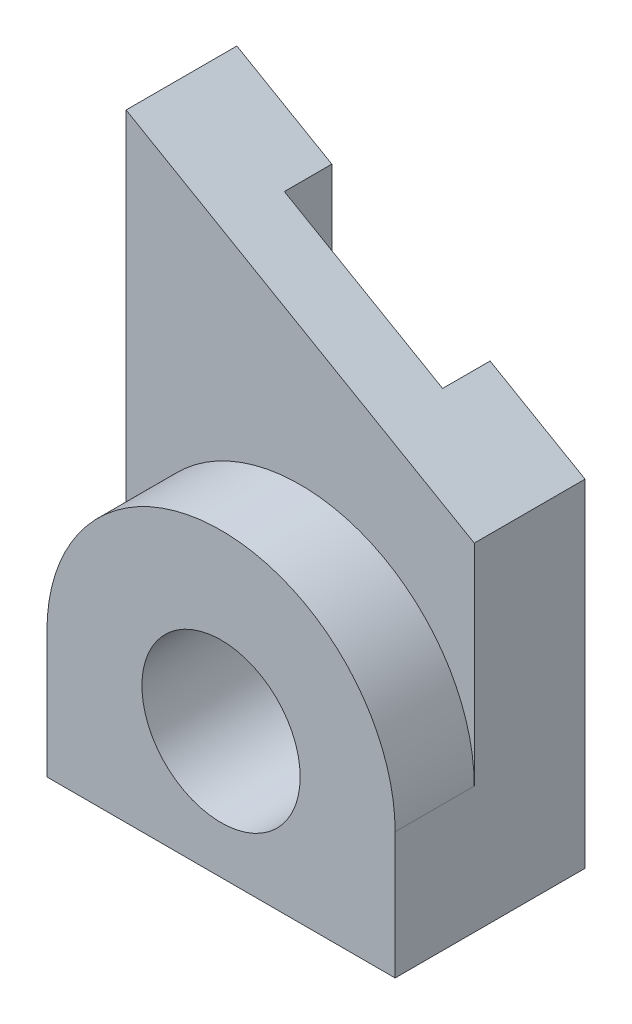
ISO-10303-21;
HEADER;
FILE_DESCRIPTION(('STEP AP214'),'2;1');
FILE_NAME('part.step','',(''),(''),'','','');
FILE_SCHEMA(('AUTOMOTIVE_DESIGN { 1 0 10303 214 1 1 1 1 }'));
ENDSEC;
DATA;
#1=APPLICATION_CONTEXT('core data for automotive mechanical design processes');
#2=APPLICATION_PROTOCOL_DEFINITION('international standard','automotive_design',2000,#1);
#3=PRODUCT_CONTEXT('',#1,'mechanical');
#4=PRODUCT('Part','Part','',(#3));
#5=PRODUCT_RELATED_PRODUCT_CATEGORY('part','',(#4));
#6=PRODUCT_DEFINITION_FORMATION('','',#4);
#7=PRODUCT_DEFINITION_CONTEXT('part definition',#1,'design');
#8=PRODUCT_DEFINITION('design','',#6,#7);
#9=PRODUCT_DEFINITION_SHAPE('','',#8);
#10=(LENGTH_UNIT() NAMED_UNIT(*) SI_UNIT(.MILLI.,.METRE.));
#11=(NAMED_UNIT(*) PLANE_ANGLE_UNIT() SI_UNIT($,.RADIAN.));
#12=(NAMED_UNIT(*) SI_UNIT($,.STERADIAN.) SOLID_ANGLE_UNIT());
#13=UNCERTAINTY_MEASURE_WITH_UNIT(LENGTH_MEASURE(1.E-05),#10,'distance_accuracy_value','');
#14=(GEOMETRIC_REPRESENTATION_CONTEXT(3) GLOBAL_UNCERTAINTY_ASSIGNED_CONTEXT((#13)) GLOBAL_UNIT_ASSIGNED_CONTEXT((#10,
#11,#12)) REPRESENTATION_CONTEXT('',''));
#15=CARTESIAN_POINT('',(0.,0.,0.));
#16=DIRECTION('',(0.,0.,1.));
#17=DIRECTION('',(1.,0.,0.));
#18=AXIS2_PLACEMENT_3D('',#15,#16,#17);
#19=CARTESIAN_POINT('',(0.,0.,-14.));
#20=DIRECTION('',(0.,0.,1.));
#21=DIRECTION('',(1.,0.,0.));
#22=AXIS2_PLACEMENT_3D('',#19,#20,#21);
#23=PLANE('',#22);
#24=DIRECTION('',(-0.866025403784436,0.500000000000004,0.));
#25=VECTOR('',#24,1.);
#26=CARTESIAN_POINT('',(17.0166604983954,29.4737205583709,-14.));
#27=LINE('',#26,#25);
#28=CARTESIAN_POINT('',(-10.,45.0717967697244,-14.));
#29=VERTEX_POINT('',#28);
#30=CARTESIAN_POINT('',(-22.,52.,-14.));
#31=VERTEX_POINT('',#30);
#32=EDGE_CURVE('E155',#29,#31,#27,.T.);
#33=ORIENTED_EDGE('',*,*,#32,.F.);
#34=DIRECTION('',(0.,-1.,0.));
#35=VECTOR('',#34,1.);
#36=CARTESIAN_POINT('',(-10.,0.,-14.));
#37=LINE('',#36,#35);
#38=CARTESIAN_POINT('',(-10.,-16.,-14.));
#39=VERTEX_POINT('',#38);
#40=EDGE_CURVE('E47',#29,#39,#37,.T.);
#41=ORIENTED_EDGE('',*,*,#40,.T.);
#42=DIRECTION('',(1.,0.,0.));
#43=VECTOR('',#42,1.);
#44=CARTESIAN_POINT('',(0.,-16.,-14.));
#45=LINE('',#44,#43);
#46=CARTESIAN_POINT('',(-22.,-16.,-14.));
#47=VERTEX_POINT('',#46);
#48=EDGE_CURVE('E146',#47,#39,#45,.T.);
#49=ORIENTED_EDGE('',*,*,#48,.F.);
#50=DIRECTION('',(0.,-1.,0.));
#51=VECTOR('',#50,1.);
#52=CARTESIAN_POINT('',(-22.,0.,-14.));
#53=LINE('',#52,#51);
#54=EDGE_CURVE('E147',#31,#47,#53,.T.);
#55=ORIENTED_EDGE('',*,*,#54,.F.);
#56=EDGE_LOOP('',(#33,#41,#49,#55));
#57=FACE_BOUND('',#56,.T.);
#58=ADVANCED_FACE('F39',(#57),#23,.F.);
#59=CARTESIAN_POINT('',(0.,0.,10.));
#60=DIRECTION('',(0.,0.,-1.));
#61=DIRECTION('',(-1.,0.,0.));
#62=AXIS2_PLACEMENT_3D('',#59,#60,#61);
#63=CYLINDRICAL_SURFACE('',#62,22.);
#64=CARTESIAN_POINT('',(0.,0.,0.));
#65=DIRECTION('',(0.,0.,1.));
#66=DIRECTION('',(1.,0.,0.));
#67=AXIS2_PLACEMENT_3D('',#64,#65,#66);
#68=CIRCLE('',#67,22.);
#69=CARTESIAN_POINT('',(-22.,0.,0.));
#70=VERTEX_POINT('',#69);
#71=CARTESIAN_POINT('',(22.,0.,0.));
#72=VERTEX_POINT('',#71);
#73=EDGE_CURVE('E169',#70,#72,#68,.F.);
#74=ORIENTED_EDGE('',*,*,#73,.F.);
#75=DIRECTION('',(0.,0.,-1.));
#76=VECTOR('',#75,1.);
#77=CARTESIAN_POINT('',(-22.,0.,10.));
#78=LINE('',#77,#76);
#79=CARTESIAN_POINT('',(-22.,0.,10.));
#80=VERTEX_POINT('',#79);
#81=EDGE_CURVE('E130',#80,#70,#78,.T.);
#82=ORIENTED_EDGE('',*,*,#81,.F.);
#83=CARTESIAN_POINT('',(0.,0.,10.));
#84=DIRECTION('',(0.,0.,1.));
#85=DIRECTION('',(1.,0.,0.));
#86=AXIS2_PLACEMENT_3D('',#83,#84,#85);
#87=CIRCLE('',#86,22.);
#88=CARTESIAN_POINT('',(22.,0.,10.));
#89=VERTEX_POINT('',#88);
#90=EDGE_CURVE('E175',#80,#89,#87,.F.);
#91=ORIENTED_EDGE('',*,*,#90,.T.);
#92=DIRECTION('',(0.,0.,-1.));
#93=VECTOR('',#92,1.);
#94=CARTESIAN_POINT('',(22.,0.,10.));
#95=LINE('',#94,#93);
#96=EDGE_CURVE('E186',#89,#72,#95,.T.);
#97=ORIENTED_EDGE('',*,*,#96,.T.);
#98=EDGE_LOOP('',(#74,#82,#91,#97));
#99=FACE_BOUND('',#98,.T.);
#100=ADVANCED_FACE('F244',(#99),#63,.T.);
#101=CARTESIAN_POINT('',(-22.,0.,10.));
#102=DIRECTION('',(1.,0.,0.));
#103=DIRECTION('',(0.,1.,0.));
#104=AXIS2_PLACEMENT_3D('',#101,#102,#103);
#105=PLANE('',#104);
#106=ORIENTED_EDGE('',*,*,#81,.T.);
#107=DIRECTION('',(0.,-1.,0.));
#108=VECTOR('',#107,1.);
#109=CARTESIAN_POINT('',(-22.,0.,0.));
#110=LINE('',#109,#108);
#111=CARTESIAN_POINT('',(-22.,52.,0.));
#112=VERTEX_POINT('',#111);
#113=EDGE_CURVE('E159',#112,#70,#110,.T.);
#114=ORIENTED_EDGE('',*,*,#113,.F.);
#115=DIRECTION('',(0.,0.,1.));
#116=VECTOR('',#115,1.);
#117=CARTESIAN_POINT('',(-22.,52.,-14.));
#118=LINE('',#117,#116);
#119=EDGE_CURVE('E167',#31,#112,#118,.T.);
#120=ORIENTED_EDGE('',*,*,#119,.F.);
#121=ORIENTED_EDGE('',*,*,#54,.T.);
#122=DIRECTION('',(0.,0.,-1.));
#123=VECTOR('',#122,1.);
#124=CARTESIAN_POINT('',(-22.,-16.,10.));
#125=LINE('',#124,#123);
#126=CARTESIAN_POINT('',(-22.,-16.,10.));
#127=VERTEX_POINT('',#126);
#128=EDGE_CURVE('E192',#127,#47,#125,.T.);
#129=ORIENTED_EDGE('',*,*,#128,.F.);
#130=DIRECTION('',(0.,-1.,0.));
#131=VECTOR('',#130,1.);
#132=CARTESIAN_POINT('',(-22.,0.,10.));
#133=LINE('',#132,#131);
#134=EDGE_CURVE('E178',#80,#127,#133,.T.);
#135=ORIENTED_EDGE('',*,*,#134,.F.);
#136=EDGE_LOOP('',(#106,#114,#120,#121,#129,#135));
#137=FACE_BOUND('',#136,.T.);
#138=ADVANCED_FACE('F204',(#137),#105,.F.);
#139=CARTESIAN_POINT('',(0.,-16.,10.));
#140=DIRECTION('',(0.,1.,0.));
#141=DIRECTION('',(0.,0.,1.));
#142=AXIS2_PLACEMENT_3D('',#139,#140,#141);
#143=PLANE('',#142);
#144=ORIENTED_EDGE('',*,*,#48,.T.);
#145=DIRECTION('',(0.,0.,-1.));
#146=VECTOR('',#145,1.);
#147=CARTESIAN_POINT('',(-10.,-16.,-14.));
#148=LINE('',#147,#146);
#149=CARTESIAN_POINT('',(-10.,-16.,-8.));
#150=VERTEX_POINT('',#149);
#151=EDGE_CURVE('E200',#150,#39,#148,.T.);
#152=ORIENTED_EDGE('',*,*,#151,.F.);
#153=DIRECTION('',(-1.,0.,0.));
#154=VECTOR('',#153,1.);
#155=CARTESIAN_POINT('',(-10.,-16.,-8.));
#156=LINE('',#155,#154);
#157=CARTESIAN_POINT('',(10.,-16.,-8.));
#158=VERTEX_POINT('',#157);
#159=EDGE_CURVE('E140',#158,#150,#156,.T.);
#160=ORIENTED_EDGE('',*,*,#159,.F.);
#161=DIRECTION('',(0.,0.,1.));
#162=VECTOR('',#161,1.);
#163=CARTESIAN_POINT('',(10.,-16.,-8.));
#164=LINE('',#163,#162);
#165=CARTESIAN_POINT('',(10.,-16.,-14.));
#166=VERTEX_POINT('',#165);
#167=EDGE_CURVE('E124',#166,#158,#164,.T.);
#168=ORIENTED_EDGE('',*,*,#167,.F.);
#169=CARTESIAN_POINT('',(22.,-16.,-14.));
#170=VERTEX_POINT('',#169);
#171=EDGE_CURVE('E136',#166,#170,#45,.T.);
#172=ORIENTED_EDGE('',*,*,#171,.T.);
#173=DIRECTION('',(0.,0.,-1.));
#174=VECTOR('',#173,1.);
#175=CARTESIAN_POINT('',(22.,-16.,10.));
#176=LINE('',#175,#174);
#177=CARTESIAN_POINT('',(22.,-16.,10.));
#178=VERTEX_POINT('',#177);
#179=EDGE_CURVE('E190',#178,#170,#176,.T.);
#180=ORIENTED_EDGE('',*,*,#179,.F.);
#181=DIRECTION('',(1.,0.,0.));
#182=VECTOR('',#181,1.);
#183=CARTESIAN_POINT('',(0.,-16.,10.));
#184=LINE('',#183,#182);
#185=EDGE_CURVE('E181',#127,#178,#184,.T.);
#186=ORIENTED_EDGE('',*,*,#185,.F.);
#187=ORIENTED_EDGE('',*,*,#128,.T.);
#188=EDGE_LOOP('',(#144,#152,#160,#168,#172,#180,#186,#187));
#189=FACE_BOUND('',#188,.T.);
#190=ADVANCED_FACE('F134',(#189),#143,.F.);
#191=CARTESIAN_POINT('',(0.,0.,10.));
#192=DIRECTION('',(0.,0.,-1.));
#193=DIRECTION('',(-1.,0.,0.));
#194=AXIS2_PLACEMENT_3D('',#191,#192,#193);
#195=CYLINDRICAL_SURFACE('',#194,10.);
#196=CARTESIAN_POINT('',(0.,0.,-8.));
#197=DIRECTION('',(0.,0.,1.));
#198=DIRECTION('',(1.,0.,0.));
#199=AXIS2_PLACEMENT_3D('',#196,#197,#198);
#200=CIRCLE('',#199,10.);
#201=CARTESIAN_POINT('',(10.,0.,-8.));
#202=VERTEX_POINT('',#201);
#203=CARTESIAN_POINT('',(-10.,0.,-8.));
#204=VERTEX_POINT('',#203);
#205=EDGE_CURVE('E163',#202,#204,#200,.T.);
#206=ORIENTED_EDGE('',*,*,#205,.F.);
#207=EDGE_CURVE('E213',#204,#202,#200,.T.);
#208=ORIENTED_EDGE('',*,*,#207,.F.);
#209=EDGE_LOOP('',(#206,#208));
#210=FACE_BOUND('',#209,.T.);
#211=CARTESIAN_POINT('',(0.,0.,10.));
#212=DIRECTION('',(0.,0.,1.));
#213=DIRECTION('',(1.,0.,0.));
#214=AXIS2_PLACEMENT_3D('',#211,#212,#213);
#215=CIRCLE('',#214,10.);
#216=CARTESIAN_POINT('',(10.,0.,10.));
#217=VERTEX_POINT('',#216);
#218=EDGE_CURVE('E172',#217,#217,#215,.T.);
#219=ORIENTED_EDGE('',*,*,#218,.T.);
#220=EDGE_LOOP('',(#219));
#221=FACE_BOUND('',#220,.T.);
#222=ADVANCED_FACE('F41',(#210,#221),#195,.F.);
#223=CARTESIAN_POINT('',(22.,0.,10.));
#224=DIRECTION('',(-1.,0.,0.));
#225=DIRECTION('',(0.,0.,1.));
#226=AXIS2_PLACEMENT_3D('',#223,#224,#225);
#227=PLANE('',#226);
#228=ORIENTED_EDGE('',*,*,#179,.T.);
#229=DIRECTION('',(0.,1.,0.));
#230=VECTOR('',#229,1.);
#231=CARTESIAN_POINT('',(22.,0.,-14.));
#232=LINE('',#231,#230);
#233=CARTESIAN_POINT('',(22.,26.5965881556562,-14.));
#234=VERTEX_POINT('',#233);
#235=EDGE_CURVE('E145',#170,#234,#232,.T.);
#236=ORIENTED_EDGE('',*,*,#235,.T.);
#237=DIRECTION('',(0.,0.,1.));
#238=VECTOR('',#237,1.);
#239=CARTESIAN_POINT('',(22.,26.5965881556562,-14.));
#240=LINE('',#239,#238);
#241=CARTESIAN_POINT('',(22.,26.5965881556562,0.));
#242=VERTEX_POINT('',#241);
#243=EDGE_CURVE('E158',#234,#242,#240,.T.);
#244=ORIENTED_EDGE('',*,*,#243,.T.);
#245=DIRECTION('',(0.,1.,0.));
#246=VECTOR('',#245,1.);
#247=CARTESIAN_POINT('',(22.,0.,0.));
#248=LINE('',#247,#246);
#249=EDGE_CURVE('E162',#72,#242,#248,.T.);
#250=ORIENTED_EDGE('',*,*,#249,.F.);
#251=ORIENTED_EDGE('',*,*,#96,.F.);
#252=DIRECTION('',(0.,1.,0.));
#253=VECTOR('',#252,1.);
#254=CARTESIAN_POINT('',(22.,0.,10.));
#255=LINE('',#254,#253);
#256=EDGE_CURVE('E184',#178,#89,#255,.T.);
#257=ORIENTED_EDGE('',*,*,#256,.F.);
#258=EDGE_LOOP('',(#228,#236,#244,#250,#251,#257));
#259=FACE_BOUND('',#258,.T.);
#260=ADVANCED_FACE('F234',(#259),#227,.F.);
#261=CARTESIAN_POINT('',(0.,0.,10.));
#262=DIRECTION('',(0.,0.,1.));
#263=DIRECTION('',(1.,0.,0.));
#264=AXIS2_PLACEMENT_3D('',#261,#262,#263);
#265=PLANE('',#264);
#266=ORIENTED_EDGE('',*,*,#218,.F.);
#267=EDGE_LOOP('',(#266));
#268=FACE_BOUND('',#267,.T.);
#269=ORIENTED_EDGE('',*,*,#90,.F.);
#270=ORIENTED_EDGE('',*,*,#134,.T.);
#271=ORIENTED_EDGE('',*,*,#185,.T.);
#272=ORIENTED_EDGE('',*,*,#256,.T.);
#273=EDGE_LOOP('',(#269,#270,#271,#272));
#274=FACE_BOUND('',#273,.T.);
#275=ADVANCED_FACE('F237',(#268,#274),#265,.T.);
#276=CARTESIAN_POINT('',(17.0166604983954,29.4737205583709,-14.));
#277=DIRECTION('',(0.500000000000004,0.866025403784436,0.));
#278=DIRECTION('',(-0.866025403784436,0.500000000000004,0.));
#279=AXIS2_PLACEMENT_3D('',#276,#277,#278);
#280=PLANE('',#279);
#281=DIRECTION('',(0.,0.,1.));
#282=VECTOR('',#281,1.);
#283=CARTESIAN_POINT('',(-10.,45.0717967697244,-14.));
#284=LINE('',#283,#282);
#285=CARTESIAN_POINT('',(-10.,45.0717967697244,-8.));
#286=VERTEX_POINT('',#285);
#287=EDGE_CURVE('E212',#29,#286,#284,.T.);
#288=ORIENTED_EDGE('',*,*,#287,.F.);
#289=ORIENTED_EDGE('',*,*,#32,.T.);
#290=ORIENTED_EDGE('',*,*,#119,.T.);
#291=DIRECTION('',(-0.866025403784436,0.500000000000004,0.));
#292=VECTOR('',#291,1.);
#293=CARTESIAN_POINT('',(17.0166604983954,29.4737205583709,0.));
#294=LINE('',#293,#292);
#295=EDGE_CURVE('E150',#242,#112,#294,.T.);
#296=ORIENTED_EDGE('',*,*,#295,.F.);
#297=ORIENTED_EDGE('',*,*,#243,.F.);
#298=CARTESIAN_POINT('',(10.,33.5247913859318,-14.));
#299=VERTEX_POINT('',#298);
#300=EDGE_CURVE('E156',#234,#299,#27,.T.);
#301=ORIENTED_EDGE('',*,*,#300,.T.);
#302=DIRECTION('',(0.,0.,-1.));
#303=VECTOR('',#302,1.);
#304=CARTESIAN_POINT('',(10.,33.5247913859318,-14.));
#305=LINE('',#304,#303);
#306=CARTESIAN_POINT('',(10.,33.5247913859318,-8.));
#307=VERTEX_POINT('',#306);
#308=EDGE_CURVE('E62',#307,#299,#305,.T.);
#309=ORIENTED_EDGE('',*,*,#308,.F.);
#310=DIRECTION('',(0.866025403784436,-0.500000000000004,0.));
#311=VECTOR('',#310,1.);
#312=CARTESIAN_POINT('',(17.0166604983954,29.4737205583709,-8.));
#313=LINE('',#312,#311);
#314=EDGE_CURVE('E11',#286,#307,#313,.T.);
#315=ORIENTED_EDGE('',*,*,#314,.F.);
#316=EDGE_LOOP('',(#288,#289,#290,#296,#297,#301,#309,#315));
#317=FACE_BOUND('',#316,.T.);
#318=ADVANCED_FACE('F210',(#317),#280,.T.);
#319=ORIENTED_EDGE('',*,*,#171,.F.);
#320=DIRECTION('',(0.,1.,0.));
#321=VECTOR('',#320,1.);
#322=CARTESIAN_POINT('',(10.,0.,-14.));
#323=LINE('',#322,#321);
#324=EDGE_CURVE('E120',#166,#299,#323,.T.);
#325=ORIENTED_EDGE('',*,*,#324,.T.);
#326=ORIENTED_EDGE('',*,*,#300,.F.);
#327=ORIENTED_EDGE('',*,*,#235,.F.);
#328=EDGE_LOOP('',(#319,#325,#326,#327));
#329=FACE_BOUND('',#328,.T.);
#330=ADVANCED_FACE('F143',(#329),#23,.F.);
#331=CARTESIAN_POINT('',(0.,0.,0.));
#332=DIRECTION('',(0.,0.,1.));
#333=DIRECTION('',(1.,0.,0.));
#334=AXIS2_PLACEMENT_3D('',#331,#332,#333);
#335=PLANE('',#334);
#336=ORIENTED_EDGE('',*,*,#113,.T.);
#337=ORIENTED_EDGE('',*,*,#73,.T.);
#338=ORIENTED_EDGE('',*,*,#249,.T.);
#339=ORIENTED_EDGE('',*,*,#295,.T.);
#340=EDGE_LOOP('',(#336,#337,#338,#339));
#341=FACE_BOUND('',#340,.T.);
#342=ADVANCED_FACE('F247',(#341),#335,.T.);
#343=CARTESIAN_POINT('',(-10.,52.,-8.));
#344=DIRECTION('',(0.,0.,1.));
#345=DIRECTION('',(1.,0.,0.));
#346=AXIS2_PLACEMENT_3D('',#343,#344,#345);
#347=PLANE('',#346);
#348=ORIENTED_EDGE('',*,*,#205,.T.);
#349=DIRECTION('',(0.,-1.,0.));
#350=VECTOR('',#349,1.);
#351=CARTESIAN_POINT('',(-10.,52.,-8.));
#352=LINE('',#351,#350);
#353=EDGE_CURVE('E54',#286,#204,#352,.T.);
#354=ORIENTED_EDGE('',*,*,#353,.F.);
#355=ORIENTED_EDGE('',*,*,#314,.T.);
#356=DIRECTION('',(0.,-1.,0.));
#357=VECTOR('',#356,1.);
#358=CARTESIAN_POINT('',(10.,52.,-8.));
#359=LINE('',#358,#357);
#360=EDGE_CURVE('E219',#307,#202,#359,.T.);
#361=ORIENTED_EDGE('',*,*,#360,.T.);
#362=EDGE_LOOP('',(#348,#354,#355,#361));
#363=FACE_BOUND('',#362,.T.);
#364=ADVANCED_FACE('F230',(#363),#347,.F.);
#365=CARTESIAN_POINT('',(-10.,52.,-14.));
#366=DIRECTION('',(-1.,0.,0.));
#367=DIRECTION('',(0.,0.,1.));
#368=AXIS2_PLACEMENT_3D('',#365,#366,#367);
#369=PLANE('',#368);
#370=EDGE_CURVE('E220',#204,#150,#352,.T.);
#371=ORIENTED_EDGE('',*,*,#370,.T.);
#372=ORIENTED_EDGE('',*,*,#151,.T.);
#373=ORIENTED_EDGE('',*,*,#40,.F.);
#374=ORIENTED_EDGE('',*,*,#287,.T.);
#375=ORIENTED_EDGE('',*,*,#353,.T.);
#376=EDGE_LOOP('',(#371,#372,#373,#374,#375));
#377=FACE_BOUND('',#376,.T.);
#378=ADVANCED_FACE('F345',(#377),#369,.F.);
#379=CARTESIAN_POINT('',(10.,52.,-8.));
#380=DIRECTION('',(1.,0.,0.));
#381=DIRECTION('',(0.,0.,-1.));
#382=AXIS2_PLACEMENT_3D('',#379,#380,#381);
#383=PLANE('',#382);
#384=ORIENTED_EDGE('',*,*,#360,.F.);
#385=ORIENTED_EDGE('',*,*,#308,.T.);
#386=ORIENTED_EDGE('',*,*,#324,.F.);
#387=ORIENTED_EDGE('',*,*,#167,.T.);
#388=EDGE_CURVE('E217',#202,#158,#359,.T.);
#389=ORIENTED_EDGE('',*,*,#388,.F.);
#390=EDGE_LOOP('',(#384,#385,#386,#387,#389));
#391=FACE_BOUND('',#390,.T.);
#392=ADVANCED_FACE('F122',(#391),#383,.F.);
#393=ORIENTED_EDGE('',*,*,#207,.T.);
#394=ORIENTED_EDGE('',*,*,#388,.T.);
#395=ORIENTED_EDGE('',*,*,#159,.T.);
#396=ORIENTED_EDGE('',*,*,#370,.F.);
#397=EDGE_LOOP('',(#393,#394,#395,#396));
#398=FACE_BOUND('',#397,.T.);
#399=ADVANCED_FACE('F224',(#398),#347,.F.);
#400=CLOSED_SHELL('',(#58,#100,#138,#190,#222,#260,#275,#318,#330,#342,#364,#378,#392,#399));
#401=MANIFOLD_SOLID_BREP('B2',#400);
#402=ADVANCED_BREP_SHAPE_REPRESENTATION('',(#18,#401),#14);
#403=SHAPE_DEFINITION_REPRESENTATION(#9,#402);
ENDSEC;
END-ISO-10303-21;
